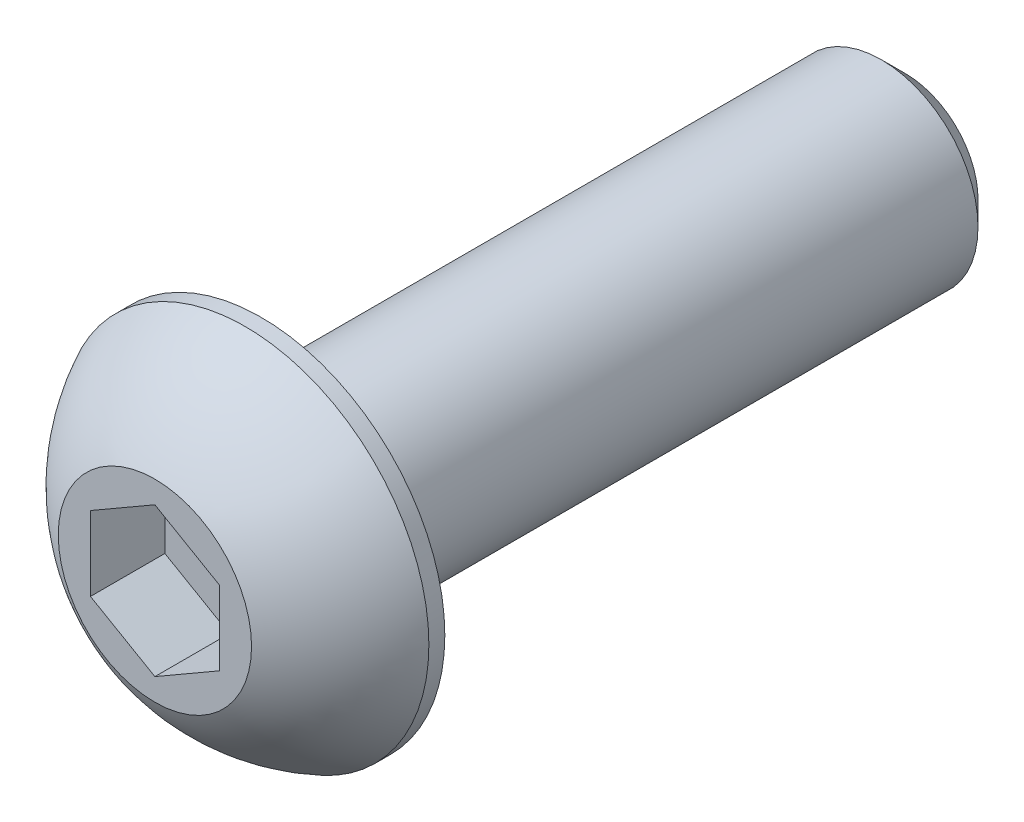
ISO-10303-21;
HEADER;
FILE_DESCRIPTION(('STEP AP214'),'2;1');
FILE_NAME('part.step','',(''),(''),'','','');
FILE_SCHEMA(('AUTOMOTIVE_DESIGN { 1 0 10303 214 1 1 1 1 }'));
ENDSEC;
DATA;
#1=APPLICATION_CONTEXT('core data for automotive mechanical design processes');
#2=APPLICATION_PROTOCOL_DEFINITION('international standard','automotive_design',2000,#1);
#3=PRODUCT_CONTEXT('',#1,'mechanical');
#4=PRODUCT('Part','Part','',(#3));
#5=PRODUCT_RELATED_PRODUCT_CATEGORY('part','',(#4));
#6=PRODUCT_DEFINITION_FORMATION('','',#4);
#7=PRODUCT_DEFINITION_CONTEXT('part definition',#1,'design');
#8=PRODUCT_DEFINITION('design','',#6,#7);
#9=PRODUCT_DEFINITION_SHAPE('','',#8);
#10=(LENGTH_UNIT() NAMED_UNIT(*) SI_UNIT(.MILLI.,.METRE.));
#11=(NAMED_UNIT(*) PLANE_ANGLE_UNIT() SI_UNIT($,.RADIAN.));
#12=(NAMED_UNIT(*) SI_UNIT($,.STERADIAN.) SOLID_ANGLE_UNIT());
#13=UNCERTAINTY_MEASURE_WITH_UNIT(LENGTH_MEASURE(1.E-05),#10,'distance_accuracy_value','');
#14=(GEOMETRIC_REPRESENTATION_CONTEXT(3) GLOBAL_UNCERTAINTY_ASSIGNED_CONTEXT((#13)) GLOBAL_UNIT_ASSIGNED_CONTEXT((#10,
#11,#12)) REPRESENTATION_CONTEXT('',''));
#15=CARTESIAN_POINT('',(0.,0.,0.));
#16=DIRECTION('',(0.,0.,1.));
#17=DIRECTION('',(1.,0.,0.));
#18=AXIS2_PLACEMENT_3D('',#15,#16,#17);
#19=CARTESIAN_POINT('',(0.,-1.5,-11.65));
#20=DIRECTION('',(0.,0.,-1.));
#21=DIRECTION('',(0.,1.,0.));
#22=AXIS2_PLACEMENT_3D('',#19,#20,#21);
#23=PLANE('',#22);
#24=CARTESIAN_POINT('',(0.,0.,-11.65));
#25=DIRECTION('',(0.,0.,-1.));
#26=DIRECTION('',(0.,1.,0.));
#27=AXIS2_PLACEMENT_3D('',#24,#25,#26);
#28=CIRCLE('',#27,1.125);
#29=CARTESIAN_POINT('',(0.,1.125,-11.65));
#30=VERTEX_POINT('',#29);
#31=EDGE_CURVE('E50',#30,#30,#28,.T.);
#32=ORIENTED_EDGE('',*,*,#31,.T.);
#33=EDGE_LOOP('',(#32));
#34=FACE_BOUND('',#33,.T.);
#35=ADVANCED_FACE('F41',(#34),#23,.T.);
#36=CARTESIAN_POINT('',(0.,0.,-11.65));
#37=DIRECTION('',(0.,0.,-1.));
#38=DIRECTION('',(0.,1.,0.));
#39=AXIS2_PLACEMENT_3D('',#36,#37,#38);
#40=CYLINDRICAL_SURFACE('',#39,1.5);
#41=CARTESIAN_POINT('',(0.,0.,-11.275));
#42=DIRECTION('',(0.,0.,-1.));
#43=DIRECTION('',(0.,1.,0.));
#44=AXIS2_PLACEMENT_3D('',#41,#42,#43);
#45=CIRCLE('',#44,1.5);
#46=CARTESIAN_POINT('',(0.,1.5,-11.275));
#47=VERTEX_POINT('',#46);
#48=EDGE_CURVE('E11',#47,#47,#45,.F.);
#49=ORIENTED_EDGE('',*,*,#48,.T.);
#50=EDGE_LOOP('',(#49));
#51=FACE_BOUND('',#50,.T.);
#52=CARTESIAN_POINT('',(0.,0.,-1.65));
#53=DIRECTION('',(0.,0.,1.));
#54=DIRECTION('',(1.,0.,0.));
#55=AXIS2_PLACEMENT_3D('',#52,#53,#54);
#56=CIRCLE('',#55,1.5);
#57=CARTESIAN_POINT('',(1.5,0.,-1.65));
#58=VERTEX_POINT('',#57);
#59=EDGE_CURVE('E177',#58,#58,#56,.F.);
#60=ORIENTED_EDGE('',*,*,#59,.T.);
#61=EDGE_LOOP('',(#60));
#62=FACE_BOUND('',#61,.T.);
#63=ADVANCED_FACE('F187',(#51,#62),#40,.T.);
#64=CARTESIAN_POINT('',(0.,0.,-11.65));
#65=DIRECTION('',(0.,0.,1.));
#66=DIRECTION('',(0.,-1.,0.));
#67=AXIS2_PLACEMENT_3D('',#64,#65,#66);
#68=CONICAL_SURFACE('',#67,1.125,0.785398163397445);
#69=ORIENTED_EDGE('',*,*,#48,.F.);
#70=EDGE_LOOP('',(#69));
#71=FACE_BOUND('',#70,.T.);
#72=ORIENTED_EDGE('',*,*,#31,.F.);
#73=EDGE_LOOP('',(#72));
#74=FACE_BOUND('',#73,.T.);
#75=ADVANCED_FACE('F43',(#71,#74),#68,.T.);
#76=CARTESIAN_POINT('',(0.,0.,-2.79483288770053));
#77=DIRECTION('',(0.,0.,1.));
#78=DIRECTION('',(0.,-1.,0.));
#79=AXIS2_PLACEMENT_3D('',#76,#77,#78);
#80=SPHERICAL_SURFACE('',#79,3.17192226735973);
#81=CARTESIAN_POINT('',(0.,0.,0.));
#82=DIRECTION('',(0.,0.,1.));
#83=DIRECTION('',(1.,0.,0.));
#84=AXIS2_PLACEMENT_3D('',#81,#82,#83);
#85=CIRCLE('',#84,1.5);
#86=CARTESIAN_POINT('',(0.,-1.5,0.));
#87=VERTEX_POINT('',#86);
#88=EDGE_CURVE('E173',#87,#87,#85,.T.);
#89=CARTESIAN_POINT('',(0.,0.,-1.4025));
#90=DIRECTION('',(0.,0.,1.));
#91=DIRECTION('',(1.,0.,0.));
#92=AXIS2_PLACEMENT_3D('',#89,#90,#91);
#93=CIRCLE('',#92,2.85);
#94=CARTESIAN_POINT('',(0.,-2.85,-1.4025));
#95=VERTEX_POINT('',#94);
#96=EDGE_CURVE('E156',#95,#95,#93,.T.);
#97=CARTESIAN_POINT('',(0.,-1.5,0.));
#98=CARTESIAN_POINT('',(0.,-1.5181600798921,-0.00974656947336525));
#99=CARTESIAN_POINT('',(0.,-1.53622513742981,-0.0196701847238475));
#100=CARTESIAN_POINT('',(0.,-1.57215840256594,-0.0398676311293121));
#101=CARTESIAN_POINT('',(0.,-1.59002661016438,-0.0501414622842944));
#102=CARTESIAN_POINT('',(0.,-1.6255593701915,-0.0710354648490241));
#103=CARTESIAN_POINT('',(0.,-1.64322392262019,-0.0816556362587714));
#104=CARTESIAN_POINT('',(0.,-1.67834266450262,-0.103238276426967));
#105=CARTESIAN_POINT('',(0.,-1.69579685395636,-0.114200745185416));
#106=CARTESIAN_POINT('',(0.,-1.73048823664554,-0.136463816635606));
#107=CARTESIAN_POINT('',(0.,-1.74772542988099,-0.147764419327347));
#108=CARTESIAN_POINT('',(0.,-1.78197627078176,-0.170699464187153));
#109=CARTESIAN_POINT('',(0.,-1.79898991844709,-0.182333906355219));
#110=CARTESIAN_POINT('',(0.,-1.83278720341135,-0.205932209546912));
#111=CARTESIAN_POINT('',(0.,-1.84957084071028,-0.21789607057054));
#112=CARTESIAN_POINT('',(0.,-1.88290172764636,-0.242148665498754));
#113=CARTESIAN_POINT('',(0.,-1.8994489772835,-0.254437399403341));
#114=CARTESIAN_POINT('',(0.,-1.93230080139369,-0.279335070725423));
#115=CARTESIAN_POINT('',(0.,-1.94860537586673,-0.291944008142919));
#116=CARTESIAN_POINT('',(0.,-1.98096565436365,-0.317477295441111));
#117=CARTESIAN_POINT('',(0.,-1.99702135838753,-0.330401645321806));
#118=CARTESIAN_POINT('',(0.,-2.02887779526296,-0.356560846652225));
#119=CARTESIAN_POINT('',(0.,-2.04467852811452,-0.369795698101948));
#120=CARTESIAN_POINT('',(0.,-2.07601901880464,-0.396570873693307));
#121=CARTESIAN_POINT('',(0.,-2.09155877664321,-0.410111197834943));
#122=CARTESIAN_POINT('',(0.,-2.12237141262985,-0.437492173862105));
#123=CARTESIAN_POINT('',(0.,-2.13764429077792,-0.451332825747633));
#124=CARTESIAN_POINT('',(0.,-2.16791736411296,-0.479309198198267));
#125=CARTESIAN_POINT('',(0.,-2.18291755929993,-0.493444918763374));
#126=CARTESIAN_POINT('',(0.,-2.21263956705415,-0.52200605739095));
#127=CARTESIAN_POINT('',(0.,-2.22736137962139,-0.536431475453418));
#128=CARTESIAN_POINT('',(0.,-2.2565210282552,-0.56556652781647));
#129=CARTESIAN_POINT('',(0.,-2.27095886432177,-0.580276162117054));
#130=CARTESIAN_POINT('',(0.,-2.2995450739765,-0.609974057702794));
#131=CARTESIAN_POINT('',(0.,-2.31369344756465,-0.624962318987951));
#132=CARTESIAN_POINT('',(0.,-2.34169535627252,-0.655211773418758));
#133=CARTESIAN_POINT('',(0.,-2.35554889139223,-0.670472966564409));
#134=CARTESIAN_POINT('',(0.,-2.38295585920366,-0.701262485885582));
#135=CARTESIAN_POINT('',(0.,-2.39650929189537,-0.716790812061104));
#136=CARTESIAN_POINT('',(0.,-2.42331090492182,-0.748108697108241));
#137=CARTESIAN_POINT('',(0.,-2.43655908525656,-0.763898255979857));
#138=CARTESIAN_POINT('',(0.,-2.46274515962755,-0.795732606824226));
#139=CARTESIAN_POINT('',(0.,-2.47568305366379,-0.811777398796979));
#140=CARTESIAN_POINT('',(0.,-2.50124363939651,-0.844116119267125));
#141=CARTESIAN_POINT('',(0.,-2.51386633109298,-0.860410047764518));
#142=CARTESIAN_POINT('',(0.,-2.53879171587278,-0.893240850042598));
#143=CARTESIAN_POINT('',(0.,-2.55109440895612,-0.909777723823285));
#144=CARTESIAN_POINT('',(0.,-2.57537512182785,-0.943088133113638));
#145=CARTESIAN_POINT('',(0.,-2.58735314161625,-0.959861668623304));
#146=CARTESIAN_POINT('',(0.,-2.61097995657956,-0.993639027894246));
#147=CARTESIAN_POINT('',(0.,-2.62262875175448,-1.01064285165552));
#148=CARTESIAN_POINT('',(0.,-2.64559269128199,-1.04487432644225));
#149=CARTESIAN_POINT('',(0.,-2.65690783563458,-1.06210197746771));
#150=CARTESIAN_POINT('',(0.,-2.67920017403639,-1.09677456077299));
#151=CARTESIAN_POINT('',(0.,-2.69017736808561,-1.11421949305282));
#152=CARTESIAN_POINT('',(0.,-2.711789634999,-1.14932001019995));
#153=CARTESIAN_POINT('',(0.,-2.72242470786316,-1.16697559506725));
#154=CARTESIAN_POINT('',(0.,-2.74334869082118,-1.20249070903943));
#155=CARTESIAN_POINT('',(0.,-2.75363760091502,-1.22035023814429));
#156=CARTESIAN_POINT('',(0.,-2.77386535089241,-1.25626645340824));
#157=CARTESIAN_POINT('',(0.,-2.78380419077596,-1.27432313956732));
#158=CARTESIAN_POINT('',(0.,-2.80332801615778,-1.31062681184411));
#159=CARTESIAN_POINT('',(0.,-2.81291300165605,-1.32887379796182));
#160=CARTESIAN_POINT('',(0.,-2.83172550494215,-1.3655511220839));
#161=CARTESIAN_POINT('',(0.,-2.84095302272998,-1.38398146008827));
#162=CARTESIAN_POINT('',(0.,-2.85,-1.4025));
#163=B_SPLINE_CURVE_WITH_KNOTS('',3,(#97,#98,#99,#100,#101,#102,#103,#104,#105,#106,#107,#108,
#109,#110,#111,#112,#113,#114,#115,#116,#117,#118,#119,#120,#121,#122,#123,#124,#125,#126,#127,
#128,#129,#130,#131,#132,#133,#134,#135,#136,#137,#138,#139,#140,#141,#142,#143,#144,#145,#146,
#147,#148,#149,#150,#151,#152,#153,#154,#155,#156,#157,#158,#159,#160,#161,#162),.UNSPECIFIED.,
.F.,.F.,(4,2,2,2,2,2,2,2,2,2,2,2,2,2,2,2,2,2,2,2,2,2,2,2,2,2,2,2,2,2,2,2,4),(0.,
0.0618298941826981,0.123659788365397,0.185489682548095,0.247319576730793,0.309149470913491,
0.37097936509619,0.432809259278888,0.494639153461585,0.556469047644284,0.618298941826982,
0.680128836009681,0.741958730192379,0.803788624375077,0.865618518557775,0.927448412740473,
0.989278306923172,1.05110820110587,1.11293809528857,1.17476798947127,1.23659788365396,
1.29842777783666,1.36025767201936,1.42208756620206,1.48391746038476,1.54574735456746,
1.60757724875015,1.66940714293285,1.73123703711555,1.79306693129825,1.85489682548095,
1.91672671966364,1.97855661384634),.UNSPECIFIED.);
#164=EDGE_CURVE('BSEAM186',#87,#95,#163,.T.);
#165=ORIENTED_EDGE('',*,*,#88,.F.);
#166=ORIENTED_EDGE('',*,*,#96,.T.);
#167=ORIENTED_EDGE('',*,*,#164,.T.);
#168=ORIENTED_EDGE('',*,*,#164,.F.);
#169=EDGE_LOOP('',(#165,#167,#166,#168));
#170=FACE_BOUND('',#169,.T.);
#171=ADVANCED_FACE('F186',(#170),#80,.T.);
#172=CARTESIAN_POINT('',(0.,-1.5,0.));
#173=DIRECTION('',(0.,0.,-1.));
#174=DIRECTION('',(-1.,0.,0.));
#175=AXIS2_PLACEMENT_3D('',#172,#173,#174);
#176=PLANE('',#175);
#177=DIRECTION('',(0.,1.,0.));
#178=VECTOR('',#177,1.);
#179=CARTESIAN_POINT('',(1.,-0.577350269189626,0.));
#180=LINE('',#179,#178);
#181=CARTESIAN_POINT('',(1.,-0.577350269189626,0.));
#182=VERTEX_POINT('',#181);
#183=CARTESIAN_POINT('',(1.,0.577350269189626,0.));
#184=VERTEX_POINT('',#183);
#185=EDGE_CURVE('E137',#182,#184,#180,.T.);
#186=ORIENTED_EDGE('',*,*,#185,.F.);
#187=DIRECTION('',(0.866025403784438,0.5,0.));
#188=VECTOR('',#187,1.);
#189=CARTESIAN_POINT('',(0.,-1.15470053837925,0.));
#190=LINE('',#189,#188);
#191=CARTESIAN_POINT('',(0.,-1.15470053837925,0.));
#192=VERTEX_POINT('',#191);
#193=EDGE_CURVE('E57',#192,#182,#190,.T.);
#194=ORIENTED_EDGE('',*,*,#193,.F.);
#195=DIRECTION('',(0.866025403784439,-0.5,0.));
#196=VECTOR('',#195,1.);
#197=CARTESIAN_POINT('',(-1.,-0.577350269189626,0.));
#198=LINE('',#197,#196);
#199=CARTESIAN_POINT('',(-1.,-0.577350269189626,0.));
#200=VERTEX_POINT('',#199);
#201=EDGE_CURVE('E150',#200,#192,#198,.T.);
#202=ORIENTED_EDGE('',*,*,#201,.F.);
#203=DIRECTION('',(0.,-1.,0.));
#204=VECTOR('',#203,1.);
#205=CARTESIAN_POINT('',(-1.,0.577350269189626,0.));
#206=LINE('',#205,#204);
#207=CARTESIAN_POINT('',(-1.,0.577350269189626,0.));
#208=VERTEX_POINT('',#207);
#209=EDGE_CURVE('E147',#208,#200,#206,.T.);
#210=ORIENTED_EDGE('',*,*,#209,.F.);
#211=DIRECTION('',(-0.866025403784438,-0.5,0.));
#212=VECTOR('',#211,1.);
#213=CARTESIAN_POINT('',(0.,1.15470053837925,0.));
#214=LINE('',#213,#212);
#215=CARTESIAN_POINT('',(0.,1.15470053837925,0.));
#216=VERTEX_POINT('',#215);
#217=EDGE_CURVE('E105',#216,#208,#214,.T.);
#218=ORIENTED_EDGE('',*,*,#217,.F.);
#219=DIRECTION('',(-0.866025403784439,0.5,0.));
#220=VECTOR('',#219,1.);
#221=CARTESIAN_POINT('',(1.,0.577350269189626,0.));
#222=LINE('',#221,#220);
#223=EDGE_CURVE('E141',#184,#216,#222,.T.);
#224=ORIENTED_EDGE('',*,*,#223,.F.);
#225=EDGE_LOOP('',(#186,#194,#202,#210,#218,#224));
#226=FACE_BOUND('',#225,.T.);
#227=ORIENTED_EDGE('',*,*,#88,.T.);
#228=EDGE_LOOP('',(#227));
#229=FACE_BOUND('',#228,.T.);
#230=ADVANCED_FACE('F193',(#226,#229),#176,.F.);
#231=CARTESIAN_POINT('',(0.,-2.85,-1.65));
#232=DIRECTION('',(0.,0.,1.));
#233=DIRECTION('',(1.,0.,0.));
#234=AXIS2_PLACEMENT_3D('',#231,#232,#233);
#235=PLANE('',#234);
#236=ORIENTED_EDGE('',*,*,#59,.F.);
#237=EDGE_LOOP('',(#236));
#238=FACE_BOUND('',#237,.T.);
#239=CARTESIAN_POINT('',(0.,0.,-1.65));
#240=DIRECTION('',(0.,0.,1.));
#241=DIRECTION('',(1.,0.,0.));
#242=AXIS2_PLACEMENT_3D('',#239,#240,#241);
#243=CIRCLE('',#242,2.85);
#244=CARTESIAN_POINT('',(2.85,0.,-1.65));
#245=VERTEX_POINT('',#244);
#246=EDGE_CURVE('E169',#245,#245,#243,.T.);
#247=ORIENTED_EDGE('',*,*,#246,.F.);
#248=EDGE_LOOP('',(#247));
#249=FACE_BOUND('',#248,.T.);
#250=ADVANCED_FACE('F205',(#238,#249),#235,.F.);
#251=CARTESIAN_POINT('',(0.,0.,0.));
#252=DIRECTION('',(0.,0.,1.));
#253=DIRECTION('',(1.,0.,0.));
#254=AXIS2_PLACEMENT_3D('',#251,#252,#253);
#255=CYLINDRICAL_SURFACE('',#254,2.85);
#256=ORIENTED_EDGE('',*,*,#96,.F.);
#257=EDGE_LOOP('',(#256));
#258=FACE_BOUND('',#257,.T.);
#259=ORIENTED_EDGE('',*,*,#246,.T.);
#260=EDGE_LOOP('',(#259));
#261=FACE_BOUND('',#260,.T.);
#262=ADVANCED_FACE('F209',(#258,#261),#255,.T.);
#263=CARTESIAN_POINT('',(0.,-1.15470053837925,-1.155));
#264=DIRECTION('',(0.5,-0.866025403784438,0.));
#265=DIRECTION('',(0.866025403784438,0.5,0.));
#266=AXIS2_PLACEMENT_3D('',#263,#264,#265);
#267=PLANE('',#266);
#268=ORIENTED_EDGE('',*,*,#193,.T.);
#269=DIRECTION('',(0.,0.,1.));
#270=VECTOR('',#269,1.);
#271=CARTESIAN_POINT('',(1.,-0.577350269189626,-1.155));
#272=LINE('',#271,#270);
#273=CARTESIAN_POINT('',(1.,-0.577350269189626,-1.155));
#274=VERTEX_POINT('',#273);
#275=EDGE_CURVE('E87',#274,#182,#272,.T.);
#276=ORIENTED_EDGE('',*,*,#275,.F.);
#277=DIRECTION('',(0.866025403784438,0.5,0.));
#278=VECTOR('',#277,1.);
#279=CARTESIAN_POINT('',(0.,-1.15470053837925,-1.155));
#280=LINE('',#279,#278);
#281=CARTESIAN_POINT('',(0.,-1.15470053837925,-1.155));
#282=VERTEX_POINT('',#281);
#283=EDGE_CURVE('E153',#282,#274,#280,.T.);
#284=ORIENTED_EDGE('',*,*,#283,.F.);
#285=DIRECTION('',(0.,0.,1.));
#286=VECTOR('',#285,1.);
#287=CARTESIAN_POINT('',(0.,-1.15470053837925,-1.155));
#288=LINE('',#287,#286);
#289=EDGE_CURVE('E65',#282,#192,#288,.T.);
#290=ORIENTED_EDGE('',*,*,#289,.T.);
#291=EDGE_LOOP('',(#268,#276,#284,#290));
#292=FACE_BOUND('',#291,.T.);
#293=ADVANCED_FACE('F213',(#292),#267,.F.);
#294=CARTESIAN_POINT('',(-1.,-0.577350269189626,-1.155));
#295=DIRECTION('',(-0.5,-0.866025403784439,0.));
#296=DIRECTION('',(0.866025403784439,-0.5,0.));
#297=AXIS2_PLACEMENT_3D('',#294,#295,#296);
#298=PLANE('',#297);
#299=ORIENTED_EDGE('',*,*,#201,.T.);
#300=ORIENTED_EDGE('',*,*,#289,.F.);
#301=DIRECTION('',(0.866025403784439,-0.5,0.));
#302=VECTOR('',#301,1.);
#303=CARTESIAN_POINT('',(-1.,-0.577350269189626,-1.155));
#304=LINE('',#303,#302);
#305=CARTESIAN_POINT('',(-1.,-0.577350269189626,-1.155));
#306=VERTEX_POINT('',#305);
#307=EDGE_CURVE('E119',#306,#282,#304,.T.);
#308=ORIENTED_EDGE('',*,*,#307,.F.);
#309=DIRECTION('',(0.,0.,1.));
#310=VECTOR('',#309,1.);
#311=CARTESIAN_POINT('',(-1.,-0.577350269189626,-1.155));
#312=LINE('',#311,#310);
#313=EDGE_CURVE('E110',#306,#200,#312,.T.);
#314=ORIENTED_EDGE('',*,*,#313,.T.);
#315=EDGE_LOOP('',(#299,#300,#308,#314));
#316=FACE_BOUND('',#315,.T.);
#317=ADVANCED_FACE('F217',(#316),#298,.F.);
#318=CARTESIAN_POINT('',(-1.,0.577350269189626,-1.155));
#319=DIRECTION('',(-1.,0.,0.));
#320=DIRECTION('',(0.,0.,1.));
#321=AXIS2_PLACEMENT_3D('',#318,#319,#320);
#322=PLANE('',#321);
#323=ORIENTED_EDGE('',*,*,#209,.T.);
#324=ORIENTED_EDGE('',*,*,#313,.F.);
#325=DIRECTION('',(0.,-1.,0.));
#326=VECTOR('',#325,1.);
#327=CARTESIAN_POINT('',(-1.,0.577350269189626,-1.155));
#328=LINE('',#327,#326);
#329=CARTESIAN_POINT('',(-1.,0.577350269189626,-1.155));
#330=VERTEX_POINT('',#329);
#331=EDGE_CURVE('E114',#330,#306,#328,.T.);
#332=ORIENTED_EDGE('',*,*,#331,.F.);
#333=DIRECTION('',(0.,0.,1.));
#334=VECTOR('',#333,1.);
#335=CARTESIAN_POINT('',(-1.,0.577350269189626,-1.155));
#336=LINE('',#335,#334);
#337=EDGE_CURVE('E98',#330,#208,#336,.T.);
#338=ORIENTED_EDGE('',*,*,#337,.T.);
#339=EDGE_LOOP('',(#323,#324,#332,#338));
#340=FACE_BOUND('',#339,.T.);
#341=ADVANCED_FACE('F115',(#340),#322,.F.);
#342=CARTESIAN_POINT('',(0.,1.15470053837925,-1.155));
#343=DIRECTION('',(-0.5,0.866025403784438,0.));
#344=DIRECTION('',(-0.866025403784438,-0.5,0.));
#345=AXIS2_PLACEMENT_3D('',#342,#343,#344);
#346=PLANE('',#345);
#347=ORIENTED_EDGE('',*,*,#217,.T.);
#348=ORIENTED_EDGE('',*,*,#337,.F.);
#349=DIRECTION('',(-0.866025403784438,-0.5,0.));
#350=VECTOR('',#349,1.);
#351=CARTESIAN_POINT('',(0.,1.15470053837925,-1.155));
#352=LINE('',#351,#350);
#353=CARTESIAN_POINT('',(0.,1.15470053837925,-1.155));
#354=VERTEX_POINT('',#353);
#355=EDGE_CURVE('E102',#354,#330,#352,.T.);
#356=ORIENTED_EDGE('',*,*,#355,.F.);
#357=DIRECTION('',(0.,0.,1.));
#358=VECTOR('',#357,1.);
#359=CARTESIAN_POINT('',(0.,1.15470053837925,-1.155));
#360=LINE('',#359,#358);
#361=EDGE_CURVE('E111',#354,#216,#360,.T.);
#362=ORIENTED_EDGE('',*,*,#361,.T.);
#363=EDGE_LOOP('',(#347,#348,#356,#362));
#364=FACE_BOUND('',#363,.T.);
#365=ADVANCED_FACE('F100',(#364),#346,.F.);
#366=CARTESIAN_POINT('',(1.,0.577350269189626,-1.155));
#367=DIRECTION('',(0.5,0.866025403784439,0.));
#368=DIRECTION('',(-0.866025403784439,0.5,0.));
#369=AXIS2_PLACEMENT_3D('',#366,#367,#368);
#370=PLANE('',#369);
#371=ORIENTED_EDGE('',*,*,#223,.T.);
#372=ORIENTED_EDGE('',*,*,#361,.F.);
#373=DIRECTION('',(-0.866025403784439,0.5,0.));
#374=VECTOR('',#373,1.);
#375=CARTESIAN_POINT('',(1.,0.577350269189626,-1.155));
#376=LINE('',#375,#374);
#377=CARTESIAN_POINT('',(1.,0.577350269189626,-1.155));
#378=VERTEX_POINT('',#377);
#379=EDGE_CURVE('E125',#378,#354,#376,.T.);
#380=ORIENTED_EDGE('',*,*,#379,.F.);
#381=DIRECTION('',(0.,0.,1.));
#382=VECTOR('',#381,1.);
#383=CARTESIAN_POINT('',(1.,0.577350269189626,-1.155));
#384=LINE('',#383,#382);
#385=EDGE_CURVE('E161',#378,#184,#384,.T.);
#386=ORIENTED_EDGE('',*,*,#385,.T.);
#387=EDGE_LOOP('',(#371,#372,#380,#386));
#388=FACE_BOUND('',#387,.T.);
#389=ADVANCED_FACE('F221',(#388),#370,.F.);
#390=CARTESIAN_POINT('',(1.,-0.577350269189626,-1.155));
#391=DIRECTION('',(1.,0.,0.));
#392=DIRECTION('',(0.,0.,-1.));
#393=AXIS2_PLACEMENT_3D('',#390,#391,#392);
#394=PLANE('',#393);
#395=ORIENTED_EDGE('',*,*,#185,.T.);
#396=ORIENTED_EDGE('',*,*,#385,.F.);
#397=DIRECTION('',(0.,1.,0.));
#398=VECTOR('',#397,1.);
#399=CARTESIAN_POINT('',(1.,-0.577350269189626,-1.155));
#400=LINE('',#399,#398);
#401=EDGE_CURVE('E129',#274,#378,#400,.T.);
#402=ORIENTED_EDGE('',*,*,#401,.F.);
#403=ORIENTED_EDGE('',*,*,#275,.T.);
#404=EDGE_LOOP('',(#395,#396,#402,#403));
#405=FACE_BOUND('',#404,.T.);
#406=ADVANCED_FACE('F218',(#405),#394,.F.);
#407=CARTESIAN_POINT('',(1.,-0.577350269189625,-1.155));
#408=DIRECTION('',(0.,0.,1.));
#409=DIRECTION('',(1.,0.,0.));
#410=AXIS2_PLACEMENT_3D('',#407,#408,#409);
#411=PLANE('',#410);
#412=ORIENTED_EDGE('',*,*,#283,.T.);
#413=ORIENTED_EDGE('',*,*,#401,.T.);
#414=ORIENTED_EDGE('',*,*,#379,.T.);
#415=ORIENTED_EDGE('',*,*,#355,.T.);
#416=ORIENTED_EDGE('',*,*,#331,.T.);
#417=ORIENTED_EDGE('',*,*,#307,.T.);
#418=EDGE_LOOP('',(#412,#413,#414,#415,#416,#417));
#419=FACE_BOUND('',#418,.T.);
#420=ADVANCED_FACE('F122',(#419),#411,.T.);
#421=CLOSED_SHELL('',(#35,#63,#75,#171,#230,#250,#262,#293,#317,#341,#365,#389,#406,#420));
#422=MANIFOLD_SOLID_BREP('B2',#421);
#423=ADVANCED_BREP_SHAPE_REPRESENTATION('',(#18,#422),#14);
#424=SHAPE_DEFINITION_REPRESENTATION(#9,#423);
ENDSEC;
END-ISO-10303-21;
